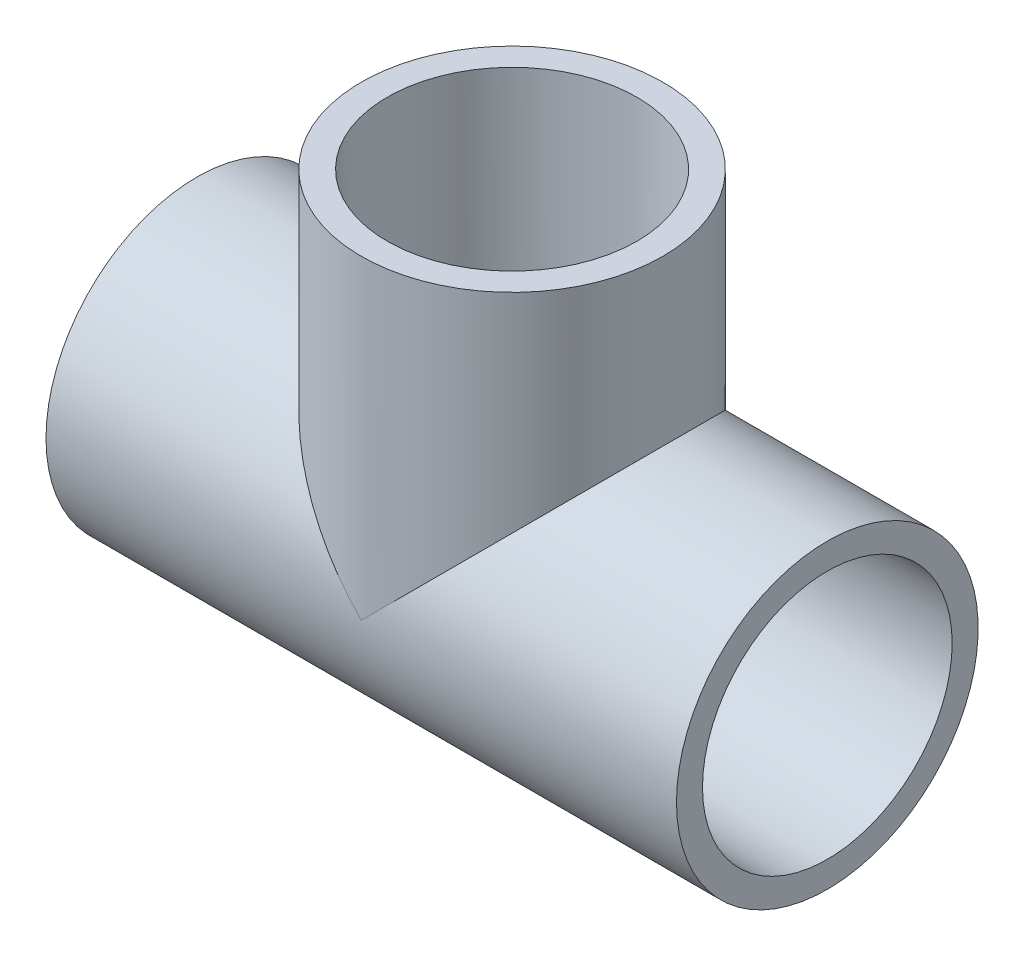
ISO-10303-21;
HEADER;
FILE_DESCRIPTION(('STEP AP214'),'2;1');
FILE_NAME('part.step','',(''),(''),'','','');
FILE_SCHEMA(('AUTOMOTIVE_DESIGN { 1 0 10303 214 1 1 1 1 }'));
ENDSEC;
DATA;
#1=APPLICATION_CONTEXT('core data for automotive mechanical design processes');
#2=APPLICATION_PROTOCOL_DEFINITION('international standard','automotive_design',2000,#1);
#3=PRODUCT_CONTEXT('',#1,'mechanical');
#4=PRODUCT('Part','Part','',(#3));
#5=PRODUCT_RELATED_PRODUCT_CATEGORY('part','',(#4));
#6=PRODUCT_DEFINITION_FORMATION('','',#4);
#7=PRODUCT_DEFINITION_CONTEXT('part definition',#1,'design');
#8=PRODUCT_DEFINITION('design','',#6,#7);
#9=PRODUCT_DEFINITION_SHAPE('','',#8);
#10=(LENGTH_UNIT() NAMED_UNIT(*) SI_UNIT(.MILLI.,.METRE.));
#11=(NAMED_UNIT(*) PLANE_ANGLE_UNIT() SI_UNIT($,.RADIAN.));
#12=(NAMED_UNIT(*) SI_UNIT($,.STERADIAN.) SOLID_ANGLE_UNIT());
#13=UNCERTAINTY_MEASURE_WITH_UNIT(LENGTH_MEASURE(1.E-05),#10,'distance_accuracy_value','');
#14=(GEOMETRIC_REPRESENTATION_CONTEXT(3) GLOBAL_UNCERTAINTY_ASSIGNED_CONTEXT((#13)) GLOBAL_UNIT_ASSIGNED_CONTEXT((#10,
#11,#12)) REPRESENTATION_CONTEXT('',''));
#15=CARTESIAN_POINT('',(0.,0.,0.));
#16=DIRECTION('',(0.,0.,1.));
#17=DIRECTION('',(1.,0.,0.));
#18=AXIS2_PLACEMENT_3D('',#15,#16,#17);
#19=CARTESIAN_POINT('',(-17.4752,0.,0.));
#20=DIRECTION('',(1.,0.,0.));
#21=DIRECTION('',(0.,0.,-1.));
#22=AXIS2_PLACEMENT_3D('',#19,#20,#21);
#23=PLANE('',#22);
#24=CARTESIAN_POINT('',(-17.4752,0.,0.));
#25=DIRECTION('',(-1.,0.,0.));
#26=DIRECTION('',(0.,0.,1.));
#27=AXIS2_PLACEMENT_3D('',#24,#25,#26);
#28=CIRCLE('',#27,16.637);
#29=CARTESIAN_POINT('',(-17.4752,0.,16.637));
#30=VERTEX_POINT('',#29);
#31=EDGE_CURVE('E91',#30,#30,#28,.T.);
#32=ORIENTED_EDGE('',*,*,#31,.T.);
#33=EDGE_LOOP('',(#32));
#34=FACE_BOUND('',#33,.T.);
#35=CARTESIAN_POINT('',(-17.4752,0.,0.));
#36=DIRECTION('',(1.,0.,0.));
#37=DIRECTION('',(0.,0.,-1.));
#38=AXIS2_PLACEMENT_3D('',#35,#36,#37);
#39=CIRCLE('',#38,13.3223);
#40=CARTESIAN_POINT('',(-17.4752,0.,-13.3223));
#41=VERTEX_POINT('',#40);
#42=EDGE_CURVE('E74',#41,#41,#39,.T.);
#43=ORIENTED_EDGE('',*,*,#42,.T.);
#44=EDGE_LOOP('',(#43));
#45=FACE_BOUND('',#44,.T.);
#46=ADVANCED_FACE('F35',(#34,#45),#23,.F.);
#47=CARTESIAN_POINT('',(17.4752,0.,0.));
#48=DIRECTION('',(1.,0.,0.));
#49=DIRECTION('',(0.,0.,-1.));
#50=AXIS2_PLACEMENT_3D('',#47,#48,#49);
#51=PLANE('',#50);
#52=CARTESIAN_POINT('',(17.4752,0.,0.));
#53=DIRECTION('',(1.,0.,0.));
#54=DIRECTION('',(0.,0.,-1.));
#55=AXIS2_PLACEMENT_3D('',#52,#53,#54);
#56=CIRCLE('',#55,13.3223);
#57=CARTESIAN_POINT('',(17.4752,0.,-13.3223));
#58=VERTEX_POINT('',#57);
#59=EDGE_CURVE('E71',#58,#58,#56,.T.);
#60=ORIENTED_EDGE('',*,*,#59,.F.);
#61=EDGE_LOOP('',(#60));
#62=FACE_BOUND('',#61,.T.);
#63=CARTESIAN_POINT('',(17.4752,0.,0.));
#64=DIRECTION('',(1.,0.,0.));
#65=DIRECTION('',(0.,0.,-1.));
#66=AXIS2_PLACEMENT_3D('',#63,#64,#65);
#67=CIRCLE('',#66,16.637);
#68=CARTESIAN_POINT('',(17.4752,0.,-16.637));
#69=VERTEX_POINT('',#68);
#70=EDGE_CURVE('E62',#69,#69,#67,.F.);
#71=ORIENTED_EDGE('',*,*,#70,.F.);
#72=EDGE_LOOP('',(#71));
#73=FACE_BOUND('',#72,.T.);
#74=ADVANCED_FACE('F113',(#62,#73),#51,.T.);
#75=CARTESIAN_POINT('',(17.4752,0.,0.));
#76=DIRECTION('',(-1.,0.,0.));
#77=DIRECTION('',(0.,0.,1.));
#78=AXIS2_PLACEMENT_3D('',#75,#76,#77);
#79=CYLINDRICAL_SURFACE('',#78,20.3327);
#80=CARTESIAN_POINT('',(-42.4942,0.,0.));
#81=DIRECTION('',(-1.,0.,0.));
#82=DIRECTION('',(0.,0.,1.));
#83=AXIS2_PLACEMENT_3D('',#80,#81,#82);
#84=CIRCLE('',#83,20.3327);
#85=CARTESIAN_POINT('',(-42.4942,0.,20.3327));
#86=VERTEX_POINT('',#85);
#87=EDGE_CURVE('E88',#86,#86,#84,.T.);
#88=ORIENTED_EDGE('',*,*,#87,.F.);
#89=EDGE_LOOP('',(#88));
#90=FACE_BOUND('',#89,.T.);
#91=CARTESIAN_POINT('',(42.4942,0.,0.));
#92=DIRECTION('',(-1.,0.,0.));
#93=DIRECTION('',(0.,0.,1.));
#94=AXIS2_PLACEMENT_3D('',#91,#92,#93);
#95=CIRCLE('',#94,20.3327);
#96=CARTESIAN_POINT('',(42.4942,0.,20.3327));
#97=VERTEX_POINT('',#96);
#98=EDGE_CURVE('E76',#97,#97,#95,.T.);
#99=ORIENTED_EDGE('',*,*,#98,.T.);
#100=EDGE_LOOP('',(#99));
#101=FACE_BOUND('',#100,.T.);
#102=CARTESIAN_POINT('',(0.,0.,0.));
#103=DIRECTION('',(-0.707106781186547,-0.707106781186547,0.));
#104=DIRECTION('',(0.707106781186547,-0.707106781186547,0.));
#105=AXIS2_PLACEMENT_3D('',#102,#103,#104);
#106=ELLIPSE('',#105,28.7547800996634,20.3327);
#107=CARTESIAN_POINT('',(0.,0.,20.3327));
#108=VERTEX_POINT('',#107);
#109=CARTESIAN_POINT('',(0.,0.,-20.3327));
#110=VERTEX_POINT('',#109);
#111=EDGE_CURVE('E97',#108,#110,#106,.T.);
#112=ORIENTED_EDGE('',*,*,#111,.T.);
#113=CARTESIAN_POINT('',(0.,0.,0.));
#114=DIRECTION('',(0.707106781186547,-0.707106781186547,0.));
#115=DIRECTION('',(-0.707106781186547,-0.707106781186547,0.));
#116=AXIS2_PLACEMENT_3D('',#113,#114,#115);
#117=ELLIPSE('',#116,28.7547800996634,20.3327);
#118=EDGE_CURVE('E54',#110,#108,#117,.T.);
#119=ORIENTED_EDGE('',*,*,#118,.T.);
#120=EDGE_LOOP('',(#112,#119));
#121=FACE_BOUND('',#120,.T.);
#122=ADVANCED_FACE('F115',(#90,#101,#121),#79,.T.);
#123=CARTESIAN_POINT('',(-17.4752,0.,0.));
#124=DIRECTION('',(-1.,0.,0.));
#125=DIRECTION('',(0.,0.,1.));
#126=AXIS2_PLACEMENT_3D('',#123,#124,#125);
#127=CONICAL_SURFACE('',#126,16.637,0.00761406605526405);
#128=CARTESIAN_POINT('',(-42.4942,0.,0.));
#129=DIRECTION('',(-1.,0.,0.));
#130=DIRECTION('',(0.,0.,1.));
#131=AXIS2_PLACEMENT_3D('',#128,#129,#130);
#132=CIRCLE('',#131,16.8275);
#133=CARTESIAN_POINT('',(-42.4942,0.,16.8275));
#134=VERTEX_POINT('',#133);
#135=EDGE_CURVE('E94',#134,#134,#132,.T.);
#136=ORIENTED_EDGE('',*,*,#135,.T.);
#137=EDGE_LOOP('',(#136));
#138=FACE_BOUND('',#137,.T.);
#139=ORIENTED_EDGE('',*,*,#31,.F.);
#140=EDGE_LOOP('',(#139));
#141=FACE_BOUND('',#140,.T.);
#142=ADVANCED_FACE('F122',(#138,#141),#127,.F.);
#143=CARTESIAN_POINT('',(42.4942,0.,0.));
#144=DIRECTION('',(1.,0.,0.));
#145=DIRECTION('',(0.,0.,-1.));
#146=AXIS2_PLACEMENT_3D('',#143,#144,#145);
#147=CONICAL_SURFACE('',#146,16.8275,0.00761406605526377);
#148=CARTESIAN_POINT('',(42.4942,0.,0.));
#149=DIRECTION('',(-1.,0.,0.));
#150=DIRECTION('',(0.,0.,1.));
#151=AXIS2_PLACEMENT_3D('',#148,#149,#150);
#152=CIRCLE('',#151,16.8275);
#153=CARTESIAN_POINT('',(42.4942,0.,16.8275));
#154=VERTEX_POINT('',#153);
#155=EDGE_CURVE('E79',#154,#154,#152,.T.);
#156=ORIENTED_EDGE('',*,*,#155,.F.);
#157=EDGE_LOOP('',(#156));
#158=FACE_BOUND('',#157,.T.);
#159=ORIENTED_EDGE('',*,*,#70,.T.);
#160=EDGE_LOOP('',(#159));
#161=FACE_BOUND('',#160,.T.);
#162=ADVANCED_FACE('F111',(#158,#161),#147,.F.);
#163=CARTESIAN_POINT('',(0.,42.4942,0.));
#164=DIRECTION('',(0.,1.,0.));
#165=DIRECTION('',(-1.,0.,0.));
#166=AXIS2_PLACEMENT_3D('',#163,#164,#165);
#167=CONICAL_SURFACE('',#166,16.8275,0.00761406605526404);
#168=CARTESIAN_POINT('',(0.,42.4942,0.));
#169=DIRECTION('',(0.,-1.,0.));
#170=DIRECTION('',(1.,0.,0.));
#171=AXIS2_PLACEMENT_3D('',#168,#169,#170);
#172=CIRCLE('',#171,16.8275);
#173=CARTESIAN_POINT('',(16.8275,42.4942,0.));
#174=VERTEX_POINT('',#173);
#175=EDGE_CURVE('E99',#174,#174,#172,.T.);
#176=ORIENTED_EDGE('',*,*,#175,.F.);
#177=EDGE_LOOP('',(#176));
#178=FACE_BOUND('',#177,.T.);
#179=CARTESIAN_POINT('',(0.,17.4752,0.));
#180=DIRECTION('',(0.,-1.,0.));
#181=DIRECTION('',(1.,0.,0.));
#182=AXIS2_PLACEMENT_3D('',#179,#180,#181);
#183=CIRCLE('',#182,16.637);
#184=CARTESIAN_POINT('',(16.637,17.4752,0.));
#185=VERTEX_POINT('',#184);
#186=EDGE_CURVE('E102',#185,#185,#183,.T.);
#187=ORIENTED_EDGE('',*,*,#186,.T.);
#188=EDGE_LOOP('',(#187));
#189=FACE_BOUND('',#188,.T.);
#190=ADVANCED_FACE('F131',(#178,#189),#167,.F.);
#191=CARTESIAN_POINT('',(20.3327,42.4942,0.));
#192=DIRECTION('',(0.,1.,0.));
#193=DIRECTION('',(-1.,0.,0.));
#194=AXIS2_PLACEMENT_3D('',#191,#192,#193);
#195=PLANE('',#194);
#196=ORIENTED_EDGE('',*,*,#175,.T.);
#197=EDGE_LOOP('',(#196));
#198=FACE_BOUND('',#197,.T.);
#199=CARTESIAN_POINT('',(0.,42.4942,0.));
#200=DIRECTION('',(0.,-1.,0.));
#201=DIRECTION('',(1.,0.,0.));
#202=AXIS2_PLACEMENT_3D('',#199,#200,#201);
#203=CIRCLE('',#202,20.3327);
#204=CARTESIAN_POINT('',(20.3327,42.4942,0.));
#205=VERTEX_POINT('',#204);
#206=EDGE_CURVE('E105',#205,#205,#203,.T.);
#207=ORIENTED_EDGE('',*,*,#206,.F.);
#208=EDGE_LOOP('',(#207));
#209=FACE_BOUND('',#208,.T.);
#210=ADVANCED_FACE('F37',(#198,#209),#195,.T.);
#211=CARTESIAN_POINT('',(0.,0.,0.));
#212=DIRECTION('',(0.,-1.,0.));
#213=DIRECTION('',(1.,0.,0.));
#214=AXIS2_PLACEMENT_3D('',#211,#212,#213);
#215=CYLINDRICAL_SURFACE('',#214,20.3327);
#216=ORIENTED_EDGE('',*,*,#118,.F.);
#217=ORIENTED_EDGE('',*,*,#111,.F.);
#218=EDGE_LOOP('',(#216,#217));
#219=FACE_BOUND('',#218,.T.);
#220=ORIENTED_EDGE('',*,*,#206,.T.);
#221=EDGE_LOOP('',(#220));
#222=FACE_BOUND('',#221,.T.);
#223=ADVANCED_FACE('F134',(#219,#222),#215,.T.);
#224=CARTESIAN_POINT('',(-42.4942,-20.3327,0.));
#225=DIRECTION('',(-1.,0.,0.));
#226=DIRECTION('',(0.,0.,1.));
#227=AXIS2_PLACEMENT_3D('',#224,#225,#226);
#228=PLANE('',#227);
#229=ORIENTED_EDGE('',*,*,#87,.T.);
#230=EDGE_LOOP('',(#229));
#231=FACE_BOUND('',#230,.T.);
#232=ORIENTED_EDGE('',*,*,#135,.F.);
#233=EDGE_LOOP('',(#232));
#234=FACE_BOUND('',#233,.T.);
#235=ADVANCED_FACE('F128',(#231,#234),#228,.T.);
#236=CARTESIAN_POINT('',(42.4942,-20.3327,0.));
#237=DIRECTION('',(1.,0.,0.));
#238=DIRECTION('',(0.,0.,-1.));
#239=AXIS2_PLACEMENT_3D('',#236,#237,#238);
#240=PLANE('',#239);
#241=ORIENTED_EDGE('',*,*,#155,.T.);
#242=EDGE_LOOP('',(#241));
#243=FACE_BOUND('',#242,.T.);
#244=ORIENTED_EDGE('',*,*,#98,.F.);
#245=EDGE_LOOP('',(#244));
#246=FACE_BOUND('',#245,.T.);
#247=ADVANCED_FACE('F140',(#243,#246),#240,.T.);
#248=CARTESIAN_POINT('',(0.,17.4752,0.));
#249=DIRECTION('',(0.,-1.,0.));
#250=DIRECTION('',(1.,0.,0.));
#251=AXIS2_PLACEMENT_3D('',#248,#249,#250);
#252=PLANE('',#251);
#253=CARTESIAN_POINT('',(0.,17.4752,0.));
#254=DIRECTION('',(0.,-1.,0.));
#255=DIRECTION('',(0.,0.,-1.));
#256=AXIS2_PLACEMENT_3D('',#253,#254,#255);
#257=CIRCLE('',#256,13.3223);
#258=CARTESIAN_POINT('',(0.,17.4752,-13.3223));
#259=VERTEX_POINT('',#258);
#260=EDGE_CURVE('E81',#259,#259,#257,.T.);
#261=ORIENTED_EDGE('',*,*,#260,.T.);
#262=EDGE_LOOP('',(#261));
#263=FACE_BOUND('',#262,.T.);
#264=ORIENTED_EDGE('',*,*,#186,.F.);
#265=EDGE_LOOP('',(#264));
#266=FACE_BOUND('',#265,.T.);
#267=ADVANCED_FACE('F66',(#263,#266),#252,.F.);
#268=CARTESIAN_POINT('',(42.4942,0.,0.));
#269=DIRECTION('',(1.,0.,0.));
#270=DIRECTION('',(0.,0.,-1.));
#271=AXIS2_PLACEMENT_3D('',#268,#269,#270);
#272=CYLINDRICAL_SURFACE('',#271,13.3223);
#273=CARTESIAN_POINT('',(0.,0.,0.));
#274=DIRECTION('',(0.707106781186547,-0.707106781186547,0.));
#275=DIRECTION('',(0.707106781186547,0.707106781186547,0.));
#276=AXIS2_PLACEMENT_3D('',#273,#274,#275);
#277=ELLIPSE('',#276,18.8405773420031,13.3223);
#278=CARTESIAN_POINT('',(0.,0.,-13.3223));
#279=VERTEX_POINT('',#278);
#280=CARTESIAN_POINT('',(0.,0.,13.3223));
#281=VERTEX_POINT('',#280);
#282=EDGE_CURVE('E11',#279,#281,#277,.T.);
#283=ORIENTED_EDGE('',*,*,#282,.F.);
#284=CARTESIAN_POINT('',(0.,0.,0.));
#285=DIRECTION('',(0.707106781186547,0.707106781186547,0.));
#286=DIRECTION('',(0.707106781186547,-0.707106781186547,0.));
#287=AXIS2_PLACEMENT_3D('',#284,#285,#286);
#288=ELLIPSE('',#287,18.8405773420031,13.3223);
#289=EDGE_CURVE('E43',#281,#279,#288,.F.);
#290=ORIENTED_EDGE('',*,*,#289,.F.);
#291=EDGE_LOOP('',(#283,#290));
#292=FACE_BOUND('',#291,.T.);
#293=ORIENTED_EDGE('',*,*,#59,.T.);
#294=EDGE_LOOP('',(#293));
#295=FACE_BOUND('',#294,.T.);
#296=ORIENTED_EDGE('',*,*,#42,.F.);
#297=EDGE_LOOP('',(#296));
#298=FACE_BOUND('',#297,.T.);
#299=ADVANCED_FACE('F63',(#292,#295,#298),#272,.F.);
#300=CARTESIAN_POINT('',(0.,0.,0.));
#301=DIRECTION('',(0.,-1.,0.));
#302=DIRECTION('',(0.,0.,-1.));
#303=AXIS2_PLACEMENT_3D('',#300,#301,#302);
#304=CYLINDRICAL_SURFACE('',#303,13.3223);
#305=ORIENTED_EDGE('',*,*,#282,.T.);
#306=ORIENTED_EDGE('',*,*,#289,.T.);
#307=EDGE_LOOP('',(#305,#306));
#308=FACE_BOUND('',#307,.T.);
#309=ORIENTED_EDGE('',*,*,#260,.F.);
#310=EDGE_LOOP('',(#309));
#311=FACE_BOUND('',#310,.T.);
#312=ADVANCED_FACE('F59',(#308,#311),#304,.F.);
#313=CLOSED_SHELL('',(#46,#74,#122,#142,#162,#190,#210,#223,#235,#247,#267,#299,#312));
#314=MANIFOLD_SOLID_BREP('B2',#313);
#315=ADVANCED_BREP_SHAPE_REPRESENTATION('',(#18,#314),#14);
#316=SHAPE_DEFINITION_REPRESENTATION(#9,#315);
ENDSEC;
END-ISO-10303-21;
